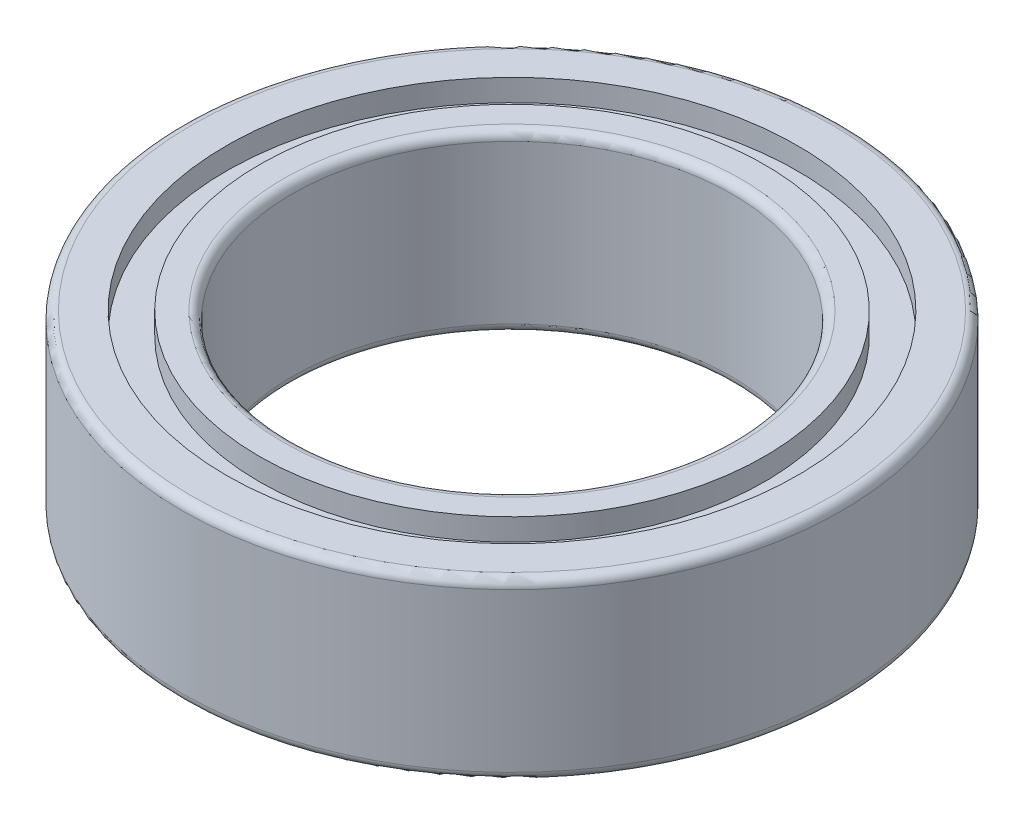
ISO-10303-21;
HEADER;
FILE_DESCRIPTION(('STEP AP214'),'2;1');
FILE_NAME('part.step','',(''),(''),'','','');
FILE_SCHEMA(('AUTOMOTIVE_DESIGN { 1 0 10303 214 1 1 1 1 }'));
ENDSEC;
DATA;
#1=APPLICATION_CONTEXT('core data for automotive mechanical design processes');
#2=APPLICATION_PROTOCOL_DEFINITION('international standard','automotive_design',2000,#1);
#3=PRODUCT_CONTEXT('',#1,'mechanical');
#4=PRODUCT('Part','Part','',(#3));
#5=PRODUCT_RELATED_PRODUCT_CATEGORY('part','',(#4));
#6=PRODUCT_DEFINITION_FORMATION('','',#4);
#7=PRODUCT_DEFINITION_CONTEXT('part definition',#1,'design');
#8=PRODUCT_DEFINITION('design','',#6,#7);
#9=PRODUCT_DEFINITION_SHAPE('','',#8);
#10=(LENGTH_UNIT() NAMED_UNIT(*) SI_UNIT(.MILLI.,.METRE.));
#11=(NAMED_UNIT(*) PLANE_ANGLE_UNIT() SI_UNIT($,.RADIAN.));
#12=(NAMED_UNIT(*) SI_UNIT($,.STERADIAN.) SOLID_ANGLE_UNIT());
#13=UNCERTAINTY_MEASURE_WITH_UNIT(LENGTH_MEASURE(1.E-05),#10,'distance_accuracy_value','');
#14=(GEOMETRIC_REPRESENTATION_CONTEXT(3) GLOBAL_UNCERTAINTY_ASSIGNED_CONTEXT((#13)) GLOBAL_UNIT_ASSIGNED_CONTEXT((#10,
#11,#12)) REPRESENTATION_CONTEXT('',''));
#15=CARTESIAN_POINT('',(0.,0.,0.));
#16=DIRECTION('',(0.,0.,1.));
#17=DIRECTION('',(1.,0.,0.));
#18=AXIS2_PLACEMENT_3D('',#15,#16,#17);
#19=CARTESIAN_POINT('',(0.,-2.,0.));
#20=DIRECTION('',(0.,1.,0.));
#21=DIRECTION('',(0.,0.,1.));
#22=AXIS2_PLACEMENT_3D('',#19,#20,#21);
#23=PLANE('',#22);
#24=CARTESIAN_POINT('',(0.,-2.,0.));
#25=DIRECTION('',(0.,1.,0.));
#26=DIRECTION('',(0.,0.,1.));
#27=AXIS2_PLACEMENT_3D('',#24,#25,#26);
#28=CIRCLE('',#27,5.2);
#29=CARTESIAN_POINT('',(0.,-2.,5.2));
#30=VERTEX_POINT('',#29);
#31=EDGE_CURVE('E60',#30,#30,#28,.T.);
#32=ORIENTED_EDGE('',*,*,#31,.T.);
#33=EDGE_LOOP('',(#32));
#34=FACE_BOUND('',#33,.T.);
#35=CARTESIAN_POINT('',(0.,-2.,0.));
#36=DIRECTION('',(0.,1.,0.));
#37=DIRECTION('',(0.,0.,1.));
#38=AXIS2_PLACEMENT_3D('',#35,#36,#37);
#39=CIRCLE('',#38,5.75);
#40=CARTESIAN_POINT('',(0.,-2.,5.75));
#41=VERTEX_POINT('',#40);
#42=EDGE_CURVE('E82',#41,#41,#39,.T.);
#43=ORIENTED_EDGE('',*,*,#42,.F.);
#44=EDGE_LOOP('',(#43));
#45=FACE_BOUND('',#44,.T.);
#46=ADVANCED_FACE('F31',(#34,#45),#23,.F.);
#47=CARTESIAN_POINT('',(0.,2.,0.));
#48=DIRECTION('',(0.,1.,0.));
#49=DIRECTION('',(0.,0.,1.));
#50=AXIS2_PLACEMENT_3D('',#47,#48,#49);
#51=PLANE('',#50);
#52=CARTESIAN_POINT('',(0.,2.,0.));
#53=DIRECTION('',(0.,1.,0.));
#54=DIRECTION('',(0.,0.,1.));
#55=AXIS2_PLACEMENT_3D('',#52,#53,#54);
#56=CIRCLE('',#55,5.2);
#57=CARTESIAN_POINT('',(0.,2.,5.2));
#58=VERTEX_POINT('',#57);
#59=EDGE_CURVE('E51',#58,#58,#56,.F.);
#60=ORIENTED_EDGE('',*,*,#59,.T.);
#61=EDGE_LOOP('',(#60));
#62=FACE_BOUND('',#61,.T.);
#63=CARTESIAN_POINT('',(0.,2.,0.));
#64=DIRECTION('',(0.,1.,0.));
#65=DIRECTION('',(0.,0.,1.));
#66=AXIS2_PLACEMENT_3D('',#63,#64,#65);
#67=CIRCLE('',#66,5.75);
#68=CARTESIAN_POINT('',(0.,2.,5.75));
#69=VERTEX_POINT('',#68);
#70=EDGE_CURVE('E70',#69,#69,#67,.T.);
#71=ORIENTED_EDGE('',*,*,#70,.T.);
#72=EDGE_LOOP('',(#71));
#73=FACE_BOUND('',#72,.T.);
#74=ADVANCED_FACE('F99',(#62,#73),#51,.T.);
#75=CARTESIAN_POINT('',(0.,-2.,0.));
#76=DIRECTION('',(0.,1.,0.));
#77=DIRECTION('',(0.,0.,1.));
#78=AXIS2_PLACEMENT_3D('',#75,#76,#77);
#79=CYLINDRICAL_SURFACE('',#78,7.5);
#80=CARTESIAN_POINT('',(0.,1.8,0.));
#81=DIRECTION('',(0.,1.,0.));
#82=DIRECTION('',(0.,0.,1.));
#83=AXIS2_PLACEMENT_3D('',#80,#81,#82);
#84=CIRCLE('',#83,7.5);
#85=CARTESIAN_POINT('',(0.,1.8,7.5));
#86=VERTEX_POINT('',#85);
#87=EDGE_CURVE('E38',#86,#86,#84,.F.);
#88=ORIENTED_EDGE('',*,*,#87,.T.);
#89=EDGE_LOOP('',(#88));
#90=FACE_BOUND('',#89,.T.);
#91=CARTESIAN_POINT('',(0.,-1.8,0.));
#92=DIRECTION('',(0.,1.,0.));
#93=DIRECTION('',(0.,0.,1.));
#94=AXIS2_PLACEMENT_3D('',#91,#92,#93);
#95=CIRCLE('',#94,7.5);
#96=CARTESIAN_POINT('',(0.,-1.8,7.5));
#97=VERTEX_POINT('',#96);
#98=EDGE_CURVE('E42',#97,#97,#95,.T.);
#99=ORIENTED_EDGE('',*,*,#98,.T.);
#100=EDGE_LOOP('',(#99));
#101=FACE_BOUND('',#100,.T.);
#102=ADVANCED_FACE('F106',(#90,#101),#79,.T.);
#103=CARTESIAN_POINT('',(0.,-2.,0.));
#104=DIRECTION('',(0.,1.,0.));
#105=DIRECTION('',(0.,0.,1.));
#106=AXIS2_PLACEMENT_3D('',#103,#104,#105);
#107=CIRCLE('',#106,7.3);
#108=CARTESIAN_POINT('',(0.,-2.,7.3));
#109=VERTEX_POINT('',#108);
#110=EDGE_CURVE('E10',#109,#109,#107,.F.);
#111=ORIENTED_EDGE('',*,*,#110,.T.);
#112=EDGE_LOOP('',(#111));
#113=FACE_BOUND('',#112,.T.);
#114=CARTESIAN_POINT('',(0.,-2.,0.));
#115=DIRECTION('',(0.,1.,0.));
#116=DIRECTION('',(0.,0.,1.));
#117=AXIS2_PLACEMENT_3D('',#114,#115,#116);
#118=CIRCLE('',#117,6.5);
#119=CARTESIAN_POINT('',(0.,-2.,6.5));
#120=VERTEX_POINT('',#119);
#121=EDGE_CURVE('E76',#120,#120,#118,.T.);
#122=ORIENTED_EDGE('',*,*,#121,.T.);
#123=EDGE_LOOP('',(#122));
#124=FACE_BOUND('',#123,.T.);
#125=ADVANCED_FACE('F102',(#113,#124),#23,.F.);
#126=CARTESIAN_POINT('',(0.,-2.,0.));
#127=DIRECTION('',(0.,1.,0.));
#128=DIRECTION('',(0.,0.,1.));
#129=AXIS2_PLACEMENT_3D('',#126,#127,#128);
#130=CYLINDRICAL_SURFACE('',#129,5.);
#131=CARTESIAN_POINT('',(0.,-1.8,0.));
#132=DIRECTION('',(0.,1.,0.));
#133=DIRECTION('',(0.,0.,1.));
#134=AXIS2_PLACEMENT_3D('',#131,#132,#133);
#135=CIRCLE('',#134,5.);
#136=CARTESIAN_POINT('',(0.,-1.8,5.));
#137=VERTEX_POINT('',#136);
#138=EDGE_CURVE('E54',#137,#137,#135,.F.);
#139=ORIENTED_EDGE('',*,*,#138,.T.);
#140=EDGE_LOOP('',(#139));
#141=FACE_BOUND('',#140,.T.);
#142=CARTESIAN_POINT('',(0.,1.8,0.));
#143=DIRECTION('',(0.,1.,0.));
#144=DIRECTION('',(0.,0.,1.));
#145=AXIS2_PLACEMENT_3D('',#142,#143,#144);
#146=CIRCLE('',#145,5.);
#147=CARTESIAN_POINT('',(0.,1.8,5.));
#148=VERTEX_POINT('',#147);
#149=EDGE_CURVE('E57',#148,#148,#146,.T.);
#150=ORIENTED_EDGE('',*,*,#149,.T.);
#151=EDGE_LOOP('',(#150));
#152=FACE_BOUND('',#151,.T.);
#153=ADVANCED_FACE('F113',(#141,#152),#130,.F.);
#154=CARTESIAN_POINT('',(0.,2.,0.));
#155=DIRECTION('',(0.,1.,0.));
#156=DIRECTION('',(0.,0.,1.));
#157=AXIS2_PLACEMENT_3D('',#154,#155,#156);
#158=CIRCLE('',#157,7.3);
#159=CARTESIAN_POINT('',(0.,2.,7.3));
#160=VERTEX_POINT('',#159);
#161=EDGE_CURVE('E46',#160,#160,#158,.T.);
#162=ORIENTED_EDGE('',*,*,#161,.T.);
#163=EDGE_LOOP('',(#162));
#164=FACE_BOUND('',#163,.T.);
#165=CARTESIAN_POINT('',(0.,2.,0.));
#166=DIRECTION('',(0.,1.,0.));
#167=DIRECTION('',(0.,0.,1.));
#168=AXIS2_PLACEMENT_3D('',#165,#166,#167);
#169=CIRCLE('',#168,6.5);
#170=CARTESIAN_POINT('',(0.,2.,6.5));
#171=VERTEX_POINT('',#170);
#172=EDGE_CURVE('E64',#171,#171,#169,.T.);
#173=ORIENTED_EDGE('',*,*,#172,.F.);
#174=EDGE_LOOP('',(#173));
#175=FACE_BOUND('',#174,.T.);
#176=ADVANCED_FACE('F109',(#164,#175),#51,.T.);
#177=CARTESIAN_POINT('',(0.,1.5,0.));
#178=DIRECTION('',(0.,1.,0.));
#179=DIRECTION('',(0.,0.,1.));
#180=AXIS2_PLACEMENT_3D('',#177,#178,#179);
#181=CYLINDRICAL_SURFACE('',#180,6.5);
#182=CARTESIAN_POINT('',(0.,1.5,0.));
#183=DIRECTION('',(0.,1.,0.));
#184=DIRECTION('',(0.,0.,1.));
#185=AXIS2_PLACEMENT_3D('',#182,#183,#184);
#186=CIRCLE('',#185,6.5);
#187=CARTESIAN_POINT('',(0.,1.5,6.5));
#188=VERTEX_POINT('',#187);
#189=EDGE_CURVE('E63',#188,#188,#186,.T.);
#190=ORIENTED_EDGE('',*,*,#189,.F.);
#191=EDGE_LOOP('',(#190));
#192=FACE_BOUND('',#191,.T.);
#193=ORIENTED_EDGE('',*,*,#172,.T.);
#194=EDGE_LOOP('',(#193));
#195=FACE_BOUND('',#194,.T.);
#196=ADVANCED_FACE('F138',(#192,#195),#181,.F.);
#197=CARTESIAN_POINT('',(0.,1.5,0.));
#198=DIRECTION('',(0.,1.,0.));
#199=DIRECTION('',(0.,0.,1.));
#200=AXIS2_PLACEMENT_3D('',#197,#198,#199);
#201=PLANE('',#200);
#202=CARTESIAN_POINT('',(0.,1.5,0.));
#203=DIRECTION('',(0.,1.,0.));
#204=DIRECTION('',(0.,0.,1.));
#205=AXIS2_PLACEMENT_3D('',#202,#203,#204);
#206=CIRCLE('',#205,5.75);
#207=CARTESIAN_POINT('',(0.,1.5,5.75));
#208=VERTEX_POINT('',#207);
#209=EDGE_CURVE('E67',#208,#208,#206,.T.);
#210=ORIENTED_EDGE('',*,*,#209,.F.);
#211=EDGE_LOOP('',(#210));
#212=FACE_BOUND('',#211,.T.);
#213=ORIENTED_EDGE('',*,*,#189,.T.);
#214=EDGE_LOOP('',(#213));
#215=FACE_BOUND('',#214,.T.);
#216=ADVANCED_FACE('F134',(#212,#215),#201,.T.);
#217=CARTESIAN_POINT('',(0.,1.5,0.));
#218=DIRECTION('',(0.,1.,0.));
#219=DIRECTION('',(0.,0.,1.));
#220=AXIS2_PLACEMENT_3D('',#217,#218,#219);
#221=CYLINDRICAL_SURFACE('',#220,5.75);
#222=ORIENTED_EDGE('',*,*,#209,.T.);
#223=EDGE_LOOP('',(#222));
#224=FACE_BOUND('',#223,.T.);
#225=ORIENTED_EDGE('',*,*,#70,.F.);
#226=EDGE_LOOP('',(#225));
#227=FACE_BOUND('',#226,.T.);
#228=ADVANCED_FACE('F128',(#224,#227),#221,.T.);
#229=CARTESIAN_POINT('',(0.,-1.5,0.));
#230=DIRECTION('',(0.,-1.,0.));
#231=DIRECTION('',(0.,0.,1.));
#232=AXIS2_PLACEMENT_3D('',#229,#230,#231);
#233=PLANE('',#232);
#234=CARTESIAN_POINT('',(0.,-1.5,0.));
#235=DIRECTION('',(0.,1.,0.));
#236=DIRECTION('',(0.,0.,1.));
#237=AXIS2_PLACEMENT_3D('',#234,#235,#236);
#238=CIRCLE('',#237,6.5);
#239=CARTESIAN_POINT('',(0.,-1.5,6.5));
#240=VERTEX_POINT('',#239);
#241=EDGE_CURVE('E73',#240,#240,#238,.T.);
#242=ORIENTED_EDGE('',*,*,#241,.F.);
#243=EDGE_LOOP('',(#242));
#244=FACE_BOUND('',#243,.T.);
#245=CARTESIAN_POINT('',(0.,-1.5,0.));
#246=DIRECTION('',(0.,1.,0.));
#247=DIRECTION('',(0.,0.,1.));
#248=AXIS2_PLACEMENT_3D('',#245,#246,#247);
#249=CIRCLE('',#248,5.75);
#250=CARTESIAN_POINT('',(0.,-1.5,5.75));
#251=VERTEX_POINT('',#250);
#252=EDGE_CURVE('E79',#251,#251,#249,.T.);
#253=ORIENTED_EDGE('',*,*,#252,.T.);
#254=EDGE_LOOP('',(#253));
#255=FACE_BOUND('',#254,.T.);
#256=ADVANCED_FACE('F88',(#244,#255),#233,.T.);
#257=CARTESIAN_POINT('',(0.,-1.5,0.));
#258=DIRECTION('',(0.,-1.,0.));
#259=DIRECTION('',(0.,0.,-1.));
#260=AXIS2_PLACEMENT_3D('',#257,#258,#259);
#261=CYLINDRICAL_SURFACE('',#260,6.5);
#262=ORIENTED_EDGE('',*,*,#241,.T.);
#263=EDGE_LOOP('',(#262));
#264=FACE_BOUND('',#263,.T.);
#265=ORIENTED_EDGE('',*,*,#121,.F.);
#266=EDGE_LOOP('',(#265));
#267=FACE_BOUND('',#266,.T.);
#268=ADVANCED_FACE('F94',(#264,#267),#261,.F.);
#269=CARTESIAN_POINT('',(0.,-1.5,0.));
#270=DIRECTION('',(0.,-1.,0.));
#271=DIRECTION('',(0.,0.,-1.));
#272=AXIS2_PLACEMENT_3D('',#269,#270,#271);
#273=CYLINDRICAL_SURFACE('',#272,5.75);
#274=ORIENTED_EDGE('',*,*,#252,.F.);
#275=EDGE_LOOP('',(#274));
#276=FACE_BOUND('',#275,.T.);
#277=ORIENTED_EDGE('',*,*,#42,.T.);
#278=EDGE_LOOP('',(#277));
#279=FACE_BOUND('',#278,.T.);
#280=ADVANCED_FACE('F90',(#276,#279),#273,.T.);
#281=CARTESIAN_POINT('',(0.,-1.8,0.));
#282=DIRECTION('',(0.,1.,0.));
#283=DIRECTION('',(0.,0.,1.));
#284=AXIS2_PLACEMENT_3D('',#281,#282,#283);
#285=TOROIDAL_SURFACE('',#284,5.2,0.2);
#286=ORIENTED_EDGE('',*,*,#138,.F.);
#287=EDGE_LOOP('',(#286));
#288=FACE_BOUND('',#287,.T.);
#289=ORIENTED_EDGE('',*,*,#31,.F.);
#290=EDGE_LOOP('',(#289));
#291=FACE_BOUND('',#290,.T.);
#292=ADVANCED_FACE('F93',(#288,#291),#285,.T.);
#293=CARTESIAN_POINT('',(0.,1.8,0.));
#294=DIRECTION('',(0.,1.,0.));
#295=DIRECTION('',(0.,0.,1.));
#296=AXIS2_PLACEMENT_3D('',#293,#294,#295);
#297=TOROIDAL_SURFACE('',#296,5.2,0.2);
#298=ORIENTED_EDGE('',*,*,#59,.F.);
#299=EDGE_LOOP('',(#298));
#300=FACE_BOUND('',#299,.T.);
#301=ORIENTED_EDGE('',*,*,#149,.F.);
#302=EDGE_LOOP('',(#301));
#303=FACE_BOUND('',#302,.T.);
#304=ADVANCED_FACE('F153',(#300,#303),#297,.T.);
#305=CARTESIAN_POINT('',(0.,1.8,0.));
#306=DIRECTION('',(0.,1.,0.));
#307=DIRECTION('',(0.,0.,1.));
#308=AXIS2_PLACEMENT_3D('',#305,#306,#307);
#309=TOROIDAL_SURFACE('',#308,7.3,0.2);
#310=ORIENTED_EDGE('',*,*,#87,.F.);
#311=EDGE_LOOP('',(#310));
#312=FACE_BOUND('',#311,.T.);
#313=ORIENTED_EDGE('',*,*,#161,.F.);
#314=EDGE_LOOP('',(#313));
#315=FACE_BOUND('',#314,.T.);
#316=ADVANCED_FACE('F151',(#312,#315),#309,.T.);
#317=CARTESIAN_POINT('',(0.,-1.8,0.));
#318=DIRECTION('',(0.,1.,0.));
#319=DIRECTION('',(0.,0.,1.));
#320=AXIS2_PLACEMENT_3D('',#317,#318,#319);
#321=TOROIDAL_SURFACE('',#320,7.3,0.2);
#322=ORIENTED_EDGE('',*,*,#110,.F.);
#323=EDGE_LOOP('',(#322));
#324=FACE_BOUND('',#323,.T.);
#325=ORIENTED_EDGE('',*,*,#98,.F.);
#326=EDGE_LOOP('',(#325));
#327=FACE_BOUND('',#326,.T.);
#328=ADVANCED_FACE('F33',(#324,#327),#321,.T.);
#329=CLOSED_SHELL('',(#46,#74,#102,#125,#153,#176,#196,#216,#228,#256,#268,#280,#292,#304,#316,#328));
#330=MANIFOLD_SOLID_BREP('B2',#329);
#331=ADVANCED_BREP_SHAPE_REPRESENTATION('',(#18,#330),#14);
#332=SHAPE_DEFINITION_REPRESENTATION(#9,#331);
ENDSEC;
END-ISO-10303-21;
